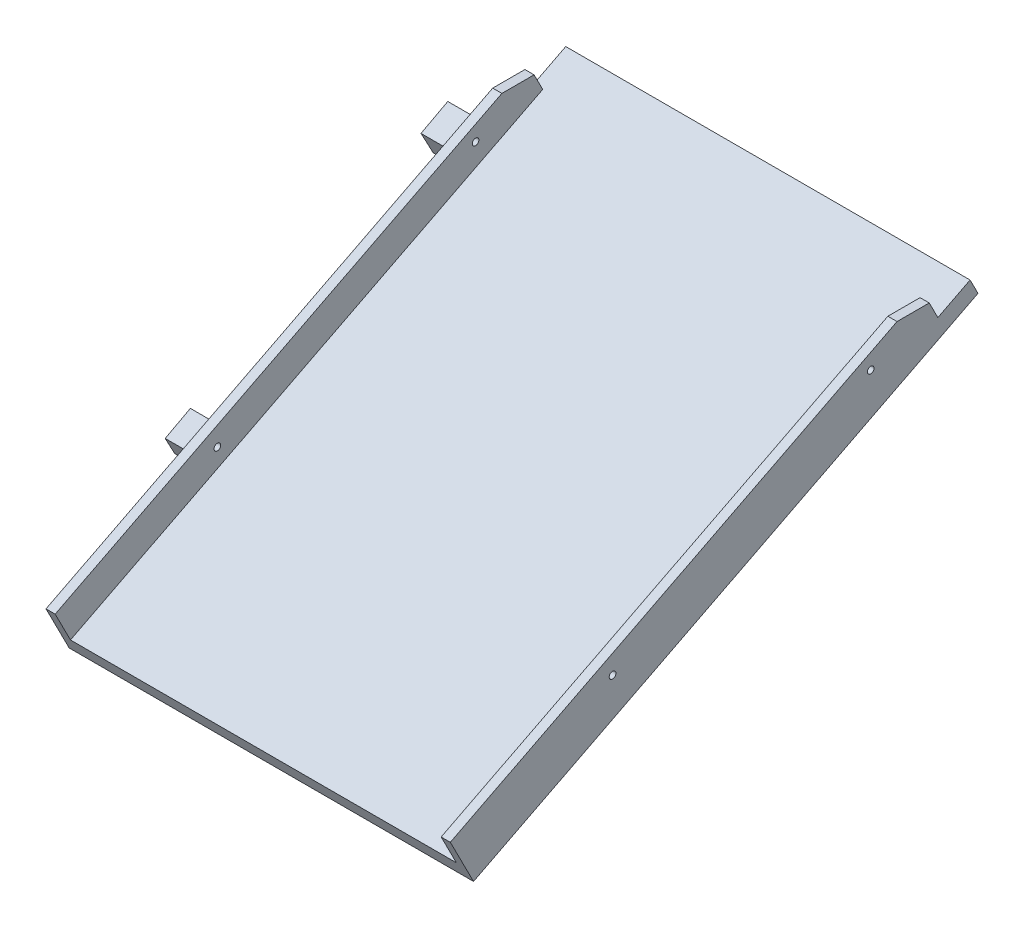
ISO-10303-21;
HEADER;
FILE_DESCRIPTION(('STEP AP214'),'2;1');
FILE_NAME('part.step','',(''),(''),'','','');
FILE_SCHEMA(('AUTOMOTIVE_DESIGN { 1 0 10303 214 1 1 1 1 }'));
ENDSEC;
DATA;
#1=APPLICATION_CONTEXT('core data for automotive mechanical design processes');
#2=APPLICATION_PROTOCOL_DEFINITION('international standard','automotive_design',2000,#1);
#3=PRODUCT_CONTEXT('',#1,'mechanical');
#4=PRODUCT('Part','Part','',(#3));
#5=PRODUCT_RELATED_PRODUCT_CATEGORY('part','',(#4));
#6=PRODUCT_DEFINITION_FORMATION('','',#4);
#7=PRODUCT_DEFINITION_CONTEXT('part definition',#1,'design');
#8=PRODUCT_DEFINITION('design','',#6,#7);
#9=PRODUCT_DEFINITION_SHAPE('','',#8);
#10=(LENGTH_UNIT() NAMED_UNIT(*) SI_UNIT(.MILLI.,.METRE.));
#11=(NAMED_UNIT(*) PLANE_ANGLE_UNIT() SI_UNIT($,.RADIAN.));
#12=(NAMED_UNIT(*) SI_UNIT($,.STERADIAN.) SOLID_ANGLE_UNIT());
#13=UNCERTAINTY_MEASURE_WITH_UNIT(LENGTH_MEASURE(1.E-05),#10,'distance_accuracy_value','');
#14=(GEOMETRIC_REPRESENTATION_CONTEXT(3) GLOBAL_UNCERTAINTY_ASSIGNED_CONTEXT((#13)) GLOBAL_UNIT_ASSIGNED_CONTEXT((#10,
#11,#12)) REPRESENTATION_CONTEXT('',''));
#15=CARTESIAN_POINT('',(0.,0.,0.));
#16=DIRECTION('',(0.,0.,1.));
#17=DIRECTION('',(1.,0.,0.));
#18=AXIS2_PLACEMENT_3D('',#15,#16,#17);
#19=CARTESIAN_POINT('',(0.,713.795181732599,-1033.05281526161));
#20=DIRECTION('',(0.,-0.453990499739548,0.891006524188367));
#21=DIRECTION('',(0.,-0.891006524188367,-0.453990499739548));
#22=AXIS2_PLACEMENT_3D('',#19,#20,#21);
#23=PLANE('',#22);
#24=DIRECTION('',(0.,-0.891006524188367,-0.453990499739548));
#25=VECTOR('',#24,1.);
#26=CARTESIAN_POINT('',(-30.,713.795181732599,-1033.05281526161));
#27=LINE('',#26,#25);
#28=CARTESIAN_POINT('',(-30.,671.238309324789,-1054.73662480428));
#29=VERTEX_POINT('',#28);
#30=CARTESIAN_POINT('',(-30.,615.784464071877,-1082.99177023296));
#31=VERTEX_POINT('',#30);
#32=EDGE_CURVE('E189',#29,#31,#27,.T.);
#33=ORIENTED_EDGE('',*,*,#32,.F.);
#34=DIRECTION('',(-1.,0.,0.));
#35=VECTOR('',#34,1.);
#36=CARTESIAN_POINT('',(10.,671.238309324789,-1054.73662480428));
#37=LINE('',#36,#35);
#38=CARTESIAN_POINT('',(0.,671.238309324789,-1054.73662480428));
#39=VERTEX_POINT('',#38);
#40=EDGE_CURVE('E218',#39,#29,#37,.T.);
#41=ORIENTED_EDGE('',*,*,#40,.F.);
#42=DIRECTION('',(0.,-0.891006524188367,-0.453990499739548));
#43=VECTOR('',#42,1.);
#44=CARTESIAN_POINT('',(0.,713.795181732599,-1033.05281526161));
#45=LINE('',#44,#43);
#46=CARTESIAN_POINT('',(0.,615.784464071878,-1082.99177023296));
#47=VERTEX_POINT('',#46);
#48=EDGE_CURVE('E314',#39,#47,#45,.T.);
#49=ORIENTED_EDGE('',*,*,#48,.T.);
#50=DIRECTION('',(-1.,0.,0.));
#51=VECTOR('',#50,1.);
#52=CARTESIAN_POINT('',(0.,615.784464071878,-1082.99177023296));
#53=LINE('',#52,#51);
#54=EDGE_CURVE('E309',#47,#31,#53,.T.);
#55=ORIENTED_EDGE('',*,*,#54,.T.);
#56=EDGE_LOOP('',(#33,#41,#49,#55));
#57=FACE_BOUND('',#56,.T.);
#58=ADVANCED_FACE('F35',(#57),#23,.F.);
#59=CARTESIAN_POINT('',(0.,148.798089539457,75.8164134565045));
#60=DIRECTION('',(0.,0.891006524188367,0.453990499739548));
#61=DIRECTION('',(0.,-0.453990499739548,0.891006524188367));
#62=AXIS2_PLACEMENT_3D('',#59,#60,#61);
#63=PLANE('',#62);
#64=DIRECTION('',(-1.,0.,0.));
#65=VECTOR('',#64,1.);
#66=CARTESIAN_POINT('',(10.,671.238309324789,-949.530250392603));
#67=LINE('',#66,#65);
#68=CARTESIAN_POINT('',(0.,671.238309324789,-949.530250392603));
#69=VERTEX_POINT('',#68);
#70=CARTESIAN_POINT('',(-30.,671.238309324789,-949.530250392603));
#71=VERTEX_POINT('',#70);
#72=EDGE_CURVE('E219',#69,#71,#67,.T.);
#73=ORIENTED_EDGE('',*,*,#72,.T.);
#74=DIRECTION('',(0.,-0.453990499739548,0.891006524188367));
#75=VECTOR('',#74,1.);
#76=CARTESIAN_POINT('',(-30.,148.798089539457,75.8164134565045));
#77=LINE('',#76,#75);
#78=CARTESIAN_POINT('',(-30.,-72.885471483364,510.894899217684));
#79=VERTEX_POINT('',#78);
#80=EDGE_CURVE('E57',#71,#79,#77,.T.);
#81=ORIENTED_EDGE('',*,*,#80,.T.);
#82=DIRECTION('',(1.,0.,0.));
#83=VECTOR('',#82,1.);
#84=CARTESIAN_POINT('',(-67.8425975613666,-72.8854714833639,510.894899217684));
#85=LINE('',#84,#83);
#86=CARTESIAN_POINT('',(0.,-72.8854714833639,510.894899217684));
#87=VERTEX_POINT('',#86);
#88=EDGE_CURVE('E194',#79,#87,#85,.T.);
#89=ORIENTED_EDGE('',*,*,#88,.T.);
#90=DIRECTION('',(0.,0.453990499739548,-0.891006524188367));
#91=VECTOR('',#90,1.);
#92=CARTESIAN_POINT('',(0.,148.798089539457,75.8164134565045));
#93=LINE('',#92,#91);
#94=EDGE_CURVE('E310',#87,#69,#93,.T.);
#95=ORIENTED_EDGE('',*,*,#94,.T.);
#96=EDGE_LOOP('',(#73,#81,#89,#95));
#97=FACE_BOUND('',#96,.T.);
#98=ADVANCED_FACE('F358',(#97),#63,.T.);
#99=CARTESIAN_POINT('',(-1321.80934580393,713.795181732599,-1033.05281526161));
#100=DIRECTION('',(0.,-0.453990499739548,0.891006524188367));
#101=DIRECTION('',(0.,-0.891006524188367,-0.453990499739548));
#102=AXIS2_PLACEMENT_3D('',#99,#100,#101);
#103=PLANE('',#102);
#104=DIRECTION('',(0.,0.891006524188367,0.453990499739548));
#105=VECTOR('',#104,1.);
#106=CARTESIAN_POINT('',(-1291.80934580393,713.795181732599,-1033.05281526161));
#107=LINE('',#106,#105);
#108=CARTESIAN_POINT('',(-1291.80934580393,615.784464071876,-1082.99177023296));
#109=VERTEX_POINT('',#108);
#110=CARTESIAN_POINT('',(-1291.80934580393,671.238309324789,-1054.73662480428));
#111=VERTEX_POINT('',#110);
#112=EDGE_CURVE('E50',#109,#111,#107,.T.);
#113=ORIENTED_EDGE('',*,*,#112,.F.);
#114=DIRECTION('',(-1.,0.,0.));
#115=VECTOR('',#114,1.);
#116=CARTESIAN_POINT('',(-1321.80934580393,615.784464071878,-1082.99177023296));
#117=LINE('',#116,#115);
#118=CARTESIAN_POINT('',(-1321.80934580393,615.784464071878,-1082.99177023296));
#119=VERTEX_POINT('',#118);
#120=EDGE_CURVE('E299',#109,#119,#117,.T.);
#121=ORIENTED_EDGE('',*,*,#120,.T.);
#122=DIRECTION('',(0.,-0.891006524188367,-0.453990499739548));
#123=VECTOR('',#122,1.);
#124=CARTESIAN_POINT('',(-1321.80934580393,713.795181732599,-1033.05281526161));
#125=LINE('',#124,#123);
#126=CARTESIAN_POINT('',(-1321.80934580393,671.238309324789,-1054.73662480428));
#127=VERTEX_POINT('',#126);
#128=EDGE_CURVE('E305',#127,#119,#125,.T.);
#129=ORIENTED_EDGE('',*,*,#128,.F.);
#130=EDGE_CURVE('E216',#111,#127,#37,.T.);
#131=ORIENTED_EDGE('',*,*,#130,.F.);
#132=EDGE_LOOP('',(#113,#121,#129,#131));
#133=FACE_BOUND('',#132,.T.);
#134=ADVANCED_FACE('F377',(#133),#103,.F.);
#135=CARTESIAN_POINT('',(0.,148.798089539457,75.8164134565045));
#136=DIRECTION('',(0.,-0.891006524188367,-0.453990499739548));
#137=DIRECTION('',(0.,0.453990499739548,-0.891006524188367));
#138=AXIS2_PLACEMENT_3D('',#135,#136,#137);
#139=PLANE('',#138);
#140=DIRECTION('',(0.,-0.453990499739548,0.891006524188367));
#141=VECTOR('',#140,1.);
#142=CARTESIAN_POINT('',(-1291.80934580393,148.798089539457,75.8164134565045));
#143=LINE('',#142,#141);
#144=CARTESIAN_POINT('',(-1291.80934580393,671.238309324789,-949.530250392603));
#145=VERTEX_POINT('',#144);
#146=CARTESIAN_POINT('',(-1291.80934580393,-72.8854714833639,510.894899217684));
#147=VERTEX_POINT('',#146);
#148=EDGE_CURVE('E205',#145,#147,#143,.T.);
#149=ORIENTED_EDGE('',*,*,#148,.F.);
#150=DIRECTION('',(1.,0.,0.));
#151=VECTOR('',#150,1.);
#152=CARTESIAN_POINT('',(0.,671.238309324789,-949.530250392603));
#153=LINE('',#152,#151);
#154=CARTESIAN_POINT('',(-1321.80934580393,671.238309324789,-949.530250392603));
#155=VERTEX_POINT('',#154);
#156=EDGE_CURVE('E342',#155,#145,#153,.T.);
#157=ORIENTED_EDGE('',*,*,#156,.F.);
#158=DIRECTION('',(0.,-0.453990499739548,0.891006524188367));
#159=VECTOR('',#158,1.);
#160=CARTESIAN_POINT('',(-1321.80934580393,148.798089539457,75.8164134565045));
#161=LINE('',#160,#159);
#162=CARTESIAN_POINT('',(-1321.80934580393,-72.8854714833639,510.894899217684));
#163=VERTEX_POINT('',#162);
#164=EDGE_CURVE('E300',#155,#163,#161,.T.);
#165=ORIENTED_EDGE('',*,*,#164,.T.);
#166=DIRECTION('',(1.,0.,0.));
#167=VECTOR('',#166,1.);
#168=CARTESIAN_POINT('',(-1253.96674824256,-72.8854714833639,510.894899217684));
#169=LINE('',#168,#167);
#170=EDGE_CURVE('E302',#163,#147,#169,.T.);
#171=ORIENTED_EDGE('',*,*,#170,.T.);
#172=EDGE_LOOP('',(#149,#157,#165,#171));
#173=FACE_BOUND('',#172,.T.);
#174=ADVANCED_FACE('F384',(#173),#139,.F.);
#175=CARTESIAN_POINT('',(-1321.80934580393,-221.683561022821,435.07848576118));
#176=DIRECTION('',(0.,-0.453990499739547,0.891006524188368));
#177=DIRECTION('',(0.,-0.891006524188368,-0.453990499739547));
#178=AXIS2_PLACEMENT_3D('',#175,#176,#177);
#179=PLANE('',#178);
#180=ORIENTED_EDGE('',*,*,#88,.F.);
#181=DIRECTION('',(0.,-0.891006524188368,-0.453990499739547));
#182=VECTOR('',#181,1.);
#183=CARTESIAN_POINT('',(-30.,-221.683561022821,435.07848576118));
#184=LINE('',#183,#182);
#185=CARTESIAN_POINT('',(-30.,-170.896189144084,460.955944246334));
#186=VERTEX_POINT('',#185);
#187=EDGE_CURVE('E187',#79,#186,#184,.T.);
#188=ORIENTED_EDGE('',*,*,#187,.T.);
#189=DIRECTION('',(1.,0.,0.));
#190=VECTOR('',#189,1.);
#191=CARTESIAN_POINT('',(-1321.80934580393,-170.896189144084,460.955944246334));
#192=LINE('',#191,#190);
#193=CARTESIAN_POINT('',(-1291.80934580393,-170.896189144084,460.955944246334));
#194=VERTEX_POINT('',#193);
#195=EDGE_CURVE('E171',#194,#186,#192,.T.);
#196=ORIENTED_EDGE('',*,*,#195,.F.);
#197=DIRECTION('',(0.,0.891006524188368,0.453990499739547));
#198=VECTOR('',#197,1.);
#199=CARTESIAN_POINT('',(-1291.80934580393,-221.683561022821,435.07848576118));
#200=LINE('',#199,#198);
#201=EDGE_CURVE('E208',#194,#147,#200,.T.);
#202=ORIENTED_EDGE('',*,*,#201,.T.);
#203=ORIENTED_EDGE('',*,*,#170,.F.);
#204=DIRECTION('',(0.,-0.891006524188368,-0.453990499739547));
#205=VECTOR('',#204,1.);
#206=CARTESIAN_POINT('',(-1321.80934580393,-221.683561022821,435.07848576118));
#207=LINE('',#206,#205);
#208=CARTESIAN_POINT('',(-1321.80934580393,-221.683561022821,435.07848576118));
#209=VERTEX_POINT('',#208);
#210=EDGE_CURVE('E327',#163,#209,#207,.T.);
#211=ORIENTED_EDGE('',*,*,#210,.T.);
#212=DIRECTION('',(1.,0.,0.));
#213=VECTOR('',#212,1.);
#214=CARTESIAN_POINT('',(-1321.80934580393,-221.683561022821,435.07848576118));
#215=LINE('',#214,#213);
#216=CARTESIAN_POINT('',(0.,-221.683561022821,435.07848576118));
#217=VERTEX_POINT('',#216);
#218=EDGE_CURVE('E183',#209,#217,#215,.T.);
#219=ORIENTED_EDGE('',*,*,#218,.T.);
#220=DIRECTION('',(0.,-0.891006524188368,-0.453990499739547));
#221=VECTOR('',#220,1.);
#222=CARTESIAN_POINT('',(0.,-221.683561022821,435.07848576118));
#223=LINE('',#222,#221);
#224=EDGE_CURVE('E321',#87,#217,#223,.T.);
#225=ORIENTED_EDGE('',*,*,#224,.F.);
#226=EDGE_LOOP('',(#180,#188,#196,#202,#203,#211,#219,#225));
#227=FACE_BOUND('',#226,.T.);
#228=ADVANCED_FACE('F192',(#227),#179,.T.);
#229=CARTESIAN_POINT('',(390.,576.93624525945,-863.46281687883));
#230=DIRECTION('',(-1.,0.,0.));
#231=DIRECTION('',(0.,0.,1.));
#232=AXIS2_PLACEMENT_3D('',#229,#230,#231);
#233=CYLINDRICAL_SURFACE('',#232,10.8050858649397);
#234=CARTESIAN_POINT('',(-1401.80934580393,576.93624525945,-863.46281687883));
#235=DIRECTION('',(-1.,0.,0.));
#236=DIRECTION('',(0.,0.,1.));
#237=AXIS2_PLACEMENT_3D('',#234,#235,#236);
#238=CIRCLE('',#237,10.8050858649397);
#239=CARTESIAN_POINT('',(-1401.80934580393,576.93624525945,-852.65773101389));
#240=VERTEX_POINT('',#239);
#241=EDGE_CURVE('E227',#240,#240,#238,.F.);
#242=ORIENTED_EDGE('',*,*,#241,.F.);
#243=EDGE_LOOP('',(#242));
#244=FACE_BOUND('',#243,.T.);
#245=CARTESIAN_POINT('',(-1291.80934580393,576.93624525945,-863.46281687883));
#246=DIRECTION('',(1.,0.,0.));
#247=DIRECTION('',(0.,0.,-1.));
#248=AXIS2_PLACEMENT_3D('',#245,#246,#247);
#249=CIRCLE('',#248,10.8050858649397);
#250=CARTESIAN_POINT('',(-1291.80934580393,576.93624525945,-874.267902743769));
#251=VERTEX_POINT('',#250);
#252=EDGE_CURVE('E213',#251,#251,#249,.T.);
#253=ORIENTED_EDGE('',*,*,#252,.T.);
#254=EDGE_LOOP('',(#253));
#255=FACE_BOUND('',#254,.T.);
#256=ADVANCED_FACE('F414',(#244,#255),#233,.F.);
#257=CARTESIAN_POINT('',(390.,135.017213440952,-19.4530162918449));
#258=DIRECTION('',(-1.,0.,0.));
#259=DIRECTION('',(0.,0.,1.));
#260=AXIS2_PLACEMENT_3D('',#257,#258,#259);
#261=CYLINDRICAL_SURFACE('',#260,10.9357547954486);
#262=CARTESIAN_POINT('',(-1401.80934580393,135.017213440952,-19.4530162918449));
#263=DIRECTION('',(-1.,0.,0.));
#264=DIRECTION('',(0.,0.,1.));
#265=AXIS2_PLACEMENT_3D('',#262,#263,#264);
#266=CIRCLE('',#265,10.9357547954486);
#267=CARTESIAN_POINT('',(-1401.80934580393,135.017213440952,-8.5172614963963));
#268=VERTEX_POINT('',#267);
#269=EDGE_CURVE('E231',#268,#268,#266,.F.);
#270=ORIENTED_EDGE('',*,*,#269,.F.);
#271=EDGE_LOOP('',(#270));
#272=FACE_BOUND('',#271,.T.);
#273=CARTESIAN_POINT('',(-1291.80934580393,135.017213440952,-19.4530162918449));
#274=DIRECTION('',(1.,0.,0.));
#275=DIRECTION('',(0.,0.,-1.));
#276=AXIS2_PLACEMENT_3D('',#273,#274,#275);
#277=CIRCLE('',#276,10.9357547954486);
#278=CARTESIAN_POINT('',(-1291.80934580393,135.017213440952,-30.3887710872936));
#279=VERTEX_POINT('',#278);
#280=EDGE_CURVE('E210',#279,#279,#277,.T.);
#281=ORIENTED_EDGE('',*,*,#280,.T.);
#282=EDGE_LOOP('',(#281));
#283=FACE_BOUND('',#282,.T.);
#284=ADVANCED_FACE('F484',(#272,#283),#261,.F.);
#285=CARTESIAN_POINT('',(0.,576.93624525945,-863.46281687883));
#286=DIRECTION('',(-1.,0.,0.));
#287=DIRECTION('',(0.,0.,1.));
#288=AXIS2_PLACEMENT_3D('',#285,#286,#287);
#289=CIRCLE('',#288,10.8050858649397);
#290=CARTESIAN_POINT('',(0.,576.93624525945,-852.65773101389));
#291=VERTEX_POINT('',#290);
#292=EDGE_CURVE('E228',#291,#291,#289,.F.);
#293=ORIENTED_EDGE('',*,*,#292,.T.);
#294=EDGE_LOOP('',(#293));
#295=FACE_BOUND('',#294,.T.);
#296=CARTESIAN_POINT('',(-30.,576.93624525945,-863.46281687883));
#297=DIRECTION('',(-1.,0.,0.));
#298=DIRECTION('',(0.,0.,1.));
#299=AXIS2_PLACEMENT_3D('',#296,#297,#298);
#300=CIRCLE('',#299,10.8050858649397);
#301=CARTESIAN_POINT('',(-30.,576.93624525945,-852.65773101389));
#302=VERTEX_POINT('',#301);
#303=EDGE_CURVE('E198',#302,#302,#300,.T.);
#304=ORIENTED_EDGE('',*,*,#303,.T.);
#305=EDGE_LOOP('',(#304));
#306=FACE_BOUND('',#305,.T.);
#307=ADVANCED_FACE('F487',(#295,#306),#233,.F.);
#308=CARTESIAN_POINT('',(0.,135.017213440952,-19.4530162918449));
#309=DIRECTION('',(-1.,0.,0.));
#310=DIRECTION('',(0.,0.,1.));
#311=AXIS2_PLACEMENT_3D('',#308,#309,#310);
#312=CIRCLE('',#311,10.9357547954486);
#313=CARTESIAN_POINT('',(0.,135.017213440952,-8.5172614963963));
#314=VERTEX_POINT('',#313);
#315=EDGE_CURVE('E232',#314,#314,#312,.F.);
#316=ORIENTED_EDGE('',*,*,#315,.T.);
#317=EDGE_LOOP('',(#316));
#318=FACE_BOUND('',#317,.T.);
#319=CARTESIAN_POINT('',(-30.,135.017213440952,-19.4530162918449));
#320=DIRECTION('',(-1.,0.,0.));
#321=DIRECTION('',(0.,0.,1.));
#322=AXIS2_PLACEMENT_3D('',#319,#320,#321);
#323=CIRCLE('',#322,10.9357547954486);
#324=CARTESIAN_POINT('',(-30.,135.017213440952,-8.5172614963963));
#325=VERTEX_POINT('',#324);
#326=EDGE_CURVE('E195',#325,#325,#323,.T.);
#327=ORIENTED_EDGE('',*,*,#326,.T.);
#328=EDGE_LOOP('',(#327));
#329=FACE_BOUND('',#328,.T.);
#330=ADVANCED_FACE('F496',(#318,#329),#261,.F.);
#331=CARTESIAN_POINT('',(10.,671.238309324789,-1054.73662480428));
#332=DIRECTION('',(0.,1.,0.));
#333=DIRECTION('',(0.,0.,1.));
#334=AXIS2_PLACEMENT_3D('',#331,#332,#333);
#335=PLANE('',#334);
#336=ORIENTED_EDGE('',*,*,#156,.T.);
#337=DIRECTION('',(0.,0.,-1.));
#338=VECTOR('',#337,1.);
#339=CARTESIAN_POINT('',(-1291.80934580393,671.238309324789,-1054.73662480428));
#340=LINE('',#339,#338);
#341=EDGE_CURVE('E11',#145,#111,#340,.T.);
#342=ORIENTED_EDGE('',*,*,#341,.T.);
#343=ORIENTED_EDGE('',*,*,#130,.T.);
#344=DIRECTION('',(0.,0.,-1.));
#345=VECTOR('',#344,1.);
#346=CARTESIAN_POINT('',(-1321.80934580393,671.238309324786,2.12503537981478E-12));
#347=LINE('',#346,#345);
#348=EDGE_CURVE('E224',#155,#127,#347,.T.);
#349=ORIENTED_EDGE('',*,*,#348,.F.);
#350=EDGE_LOOP('',(#336,#342,#343,#349));
#351=FACE_BOUND('',#350,.T.);
#352=ADVANCED_FACE('F379',(#351),#335,.T.);
#353=ORIENTED_EDGE('',*,*,#40,.T.);
#354=DIRECTION('',(0.,0.,1.));
#355=VECTOR('',#354,1.);
#356=CARTESIAN_POINT('',(-30.,671.238309324789,-1054.73662480428));
#357=LINE('',#356,#355);
#358=EDGE_CURVE('E43',#29,#71,#357,.T.);
#359=ORIENTED_EDGE('',*,*,#358,.T.);
#360=ORIENTED_EDGE('',*,*,#72,.F.);
#361=DIRECTION('',(0.,0.,-1.));
#362=VECTOR('',#361,1.);
#363=CARTESIAN_POINT('',(0.,671.238309324786,2.12503537981478E-12));
#364=LINE('',#363,#362);
#365=EDGE_CURVE('E222',#69,#39,#364,.T.);
#366=ORIENTED_EDGE('',*,*,#365,.T.);
#367=EDGE_LOOP('',(#353,#359,#360,#366));
#368=FACE_BOUND('',#367,.T.);
#369=ADVANCED_FACE('F354',(#368),#335,.T.);
#370=CARTESIAN_POINT('',(-1321.80934580393,0.,0.));
#371=DIRECTION('',(-1.,0.,0.));
#372=DIRECTION('',(0.,0.,1.));
#373=AXIS2_PLACEMENT_3D('',#370,#371,#372);
#374=PLANE('',#373);
#375=DIRECTION('',(0.,0.882586031343818,0.470150930315755));
#376=VECTOR('',#375,1.);
#377=CARTESIAN_POINT('',(-1321.80934580393,504.780648084918,-947.594315283435));
#378=LINE('',#377,#376);
#379=CARTESIAN_POINT('',(-1321.80934580393,551.922167035328,-922.482169607067));
#380=VERTEX_POINT('',#379);
#381=CARTESIAN_POINT('',(-1321.80934580393,626.858827585302,-882.563635411955));
#382=VERTEX_POINT('',#381);
#383=EDGE_CURVE('E235',#380,#382,#378,.T.);
#384=ORIENTED_EDGE('',*,*,#383,.T.);
#385=DIRECTION('',(0.,-0.470150930315754,0.882586031343818));
#386=VECTOR('',#385,1.);
#387=CARTESIAN_POINT('',(-1321.80934580393,122.078179500385,65.0306798714796));
#388=LINE('',#387,#386);
#389=CARTESIAN_POINT('',(-1321.80934580393,580.236826076621,-795.042959323498));
#390=VERTEX_POINT('',#389);
#391=EDGE_CURVE('E240',#382,#390,#388,.T.);
#392=ORIENTED_EDGE('',*,*,#391,.T.);
#393=DIRECTION('',(0.,-0.882586031343818,-0.470150930315755));
#394=VECTOR('',#393,1.);
#395=CARTESIAN_POINT('',(-1321.80934580393,458.158646576237,-860.073639194978));
#396=LINE('',#395,#394);
#397=CARTESIAN_POINT('',(-1321.80934580393,505.300165526648,-834.96149351861));
#398=VERTEX_POINT('',#397);
#399=EDGE_CURVE('E253',#390,#398,#396,.T.);
#400=ORIENTED_EDGE('',*,*,#399,.T.);
#401=DIRECTION('',(0.,0.470150930315754,-0.882586031343818));
#402=VECTOR('',#401,1.);
#403=CARTESIAN_POINT('',(-1321.80934580393,47.1415189504113,25.1121456763682));
#404=LINE('',#403,#402);
#405=EDGE_CURVE('E251',#398,#380,#404,.T.);
#406=ORIENTED_EDGE('',*,*,#405,.T.);
#407=EDGE_LOOP('',(#384,#392,#400,#406));
#408=FACE_BOUND('',#407,.T.);
#409=DIRECTION('',(0.,-0.470150930315755,0.882586031343818));
#410=VECTOR('',#409,1.);
#411=CARTESIAN_POINT('',(-1321.80934580393,122.078179500384,65.0306798714794));
#412=LINE('',#411,#410);
#413=CARTESIAN_POINT('',(-1321.80934580393,178.631674443184,-41.1337908159791));
#414=VERTEX_POINT('',#413);
#415=CARTESIAN_POINT('',(-1321.80934580393,134.758128501832,41.227375134182));
#416=VERTEX_POINT('',#415);
#417=EDGE_CURVE('E267',#414,#416,#412,.T.);
#418=ORIENTED_EDGE('',*,*,#417,.T.);
#419=DIRECTION('',(0.,-0.882586031343818,-0.470150930315755));
#420=VECTOR('',#419,1.);
#421=CARTESIAN_POINT('',(-1321.80934580393,12.6799490014478,-23.8033047372974));
#422=LINE('',#421,#420);
#423=CARTESIAN_POINT('',(-1321.80934580393,76.1045942134309,9.98281343404757));
#424=VERTEX_POINT('',#423);
#425=EDGE_CURVE('E272',#416,#424,#422,.T.);
#426=ORIENTED_EDGE('',*,*,#425,.T.);
#427=DIRECTION('',(0.,0.470150930315755,-0.882586031343818));
#428=VECTOR('',#427,1.);
#429=CARTESIAN_POINT('',(-1321.80934580393,63.4246452119832,33.786118171345));
#430=LINE('',#429,#428);
#431=CARTESIAN_POINT('',(-1321.80934580393,119.978140154783,-72.3783525161136));
#432=VERTEX_POINT('',#431);
#433=EDGE_CURVE('E285',#424,#432,#430,.T.);
#434=ORIENTED_EDGE('',*,*,#433,.T.);
#435=DIRECTION('',(0.,-0.882586031343818,-0.470150930315755));
#436=VECTOR('',#435,1.);
#437=CARTESIAN_POINT('',(-1321.80934580393,56.5534949427998,-106.164470687458));
#438=LINE('',#437,#436);
#439=EDGE_CURVE('E282',#414,#432,#438,.T.);
#440=ORIENTED_EDGE('',*,*,#439,.F.);
#441=EDGE_LOOP('',(#418,#426,#434,#440));
#442=FACE_BOUND('',#441,.T.);
#443=ORIENTED_EDGE('',*,*,#164,.F.);
#444=ORIENTED_EDGE('',*,*,#348,.T.);
#445=ORIENTED_EDGE('',*,*,#128,.T.);
#446=DIRECTION('',(0.,-0.453990499739548,0.891006524188367));
#447=VECTOR('',#446,1.);
#448=CARTESIAN_POINT('',(-1321.80934580393,50.7873718787369,25.8774584851542));
#449=LINE('',#448,#447);
#450=CARTESIAN_POINT('',(-1321.80934580393,669.440225873819,-1188.29713202633));
#451=VERTEX_POINT('',#450);
#452=EDGE_CURVE('E324',#451,#119,#449,.T.);
#453=ORIENTED_EDGE('',*,*,#452,.F.);
#454=DIRECTION('',(0.,0.891006524188365,0.453990499739553));
#455=VECTOR('',#454,1.);
#456=CARTESIAN_POINT('',(-1321.80934580393,669.440225873819,-1188.29713202633));
#457=LINE('',#456,#455);
#458=CARTESIAN_POINT('',(-1321.80934580393,618.652853995082,-1214.17459051149));
#459=VERTEX_POINT('',#458);
#460=EDGE_CURVE('E320',#459,#451,#457,.T.);
#461=ORIENTED_EDGE('',*,*,#460,.F.);
#462=DIRECTION('',(0.,0.453990499739548,-0.891006524188367));
#463=VECTOR('',#462,1.);
#464=CARTESIAN_POINT('',(-1321.80934580393,0.,0.));
#465=LINE('',#464,#463);
#466=EDGE_CURVE('E318',#209,#459,#465,.T.);
#467=ORIENTED_EDGE('',*,*,#466,.F.);
#468=ORIENTED_EDGE('',*,*,#210,.F.);
#469=EDGE_LOOP('',(#443,#444,#445,#453,#461,#467,#468));
#470=FACE_BOUND('',#469,.T.);
#471=ADVANCED_FACE('F372',(#408,#442,#470),#374,.T.);
#472=CARTESIAN_POINT('',(0.,0.,0.));
#473=DIRECTION('',(-1.,0.,0.));
#474=DIRECTION('',(0.,0.,1.));
#475=AXIS2_PLACEMENT_3D('',#472,#473,#474);
#476=PLANE('',#475);
#477=ORIENTED_EDGE('',*,*,#292,.F.);
#478=EDGE_LOOP('',(#477));
#479=FACE_BOUND('',#478,.T.);
#480=ORIENTED_EDGE('',*,*,#315,.F.);
#481=EDGE_LOOP('',(#480));
#482=FACE_BOUND('',#481,.T.);
#483=ORIENTED_EDGE('',*,*,#365,.F.);
#484=ORIENTED_EDGE('',*,*,#94,.F.);
#485=ORIENTED_EDGE('',*,*,#224,.T.);
#486=DIRECTION('',(0.,0.453990499739548,-0.891006524188367));
#487=VECTOR('',#486,1.);
#488=CARTESIAN_POINT('',(0.,0.,0.));
#489=LINE('',#488,#487);
#490=CARTESIAN_POINT('',(0.,618.652853995082,-1214.17459051149));
#491=VERTEX_POINT('',#490);
#492=EDGE_CURVE('E317',#217,#491,#489,.T.);
#493=ORIENTED_EDGE('',*,*,#492,.T.);
#494=DIRECTION('',(0.,0.891006524188365,0.453990499739553));
#495=VECTOR('',#494,1.);
#496=CARTESIAN_POINT('',(0.,669.440225873819,-1188.29713202633));
#497=LINE('',#496,#495);
#498=CARTESIAN_POINT('',(0.,669.440225873819,-1188.29713202633));
#499=VERTEX_POINT('',#498);
#500=EDGE_CURVE('E333',#491,#499,#497,.T.);
#501=ORIENTED_EDGE('',*,*,#500,.T.);
#502=DIRECTION('',(0.,-0.453990499739548,0.891006524188367));
#503=VECTOR('',#502,1.);
#504=CARTESIAN_POINT('',(0.,50.7873718787369,25.8774584851542));
#505=LINE('',#504,#503);
#506=EDGE_CURVE('E336',#499,#47,#505,.T.);
#507=ORIENTED_EDGE('',*,*,#506,.T.);
#508=ORIENTED_EDGE('',*,*,#48,.F.);
#509=EDGE_LOOP('',(#483,#484,#485,#493,#501,#507,#508));
#510=FACE_BOUND('',#509,.T.);
#511=ADVANCED_FACE('F361',(#479,#482,#510),#476,.F.);
#512=CARTESIAN_POINT('',(-1321.80934580393,50.7873718787369,25.8774584851542));
#513=DIRECTION('',(0.,0.891006524188367,0.453990499739548));
#514=DIRECTION('',(0.,-0.453990499739548,0.891006524188367));
#515=AXIS2_PLACEMENT_3D('',#512,#513,#514);
#516=PLANE('',#515);
#517=DIRECTION('',(0.,0.453990499739547,-0.891006524188368));
#518=VECTOR('',#517,1.);
#519=CARTESIAN_POINT('',(-30.,-897.280988727359,1886.56638294772));
#520=LINE('',#519,#518);
#521=EDGE_CURVE('E175',#186,#31,#520,.T.);
#522=ORIENTED_EDGE('',*,*,#521,.T.);
#523=ORIENTED_EDGE('',*,*,#54,.F.);
#524=ORIENTED_EDGE('',*,*,#506,.F.);
#525=DIRECTION('',(1.,0.,0.));
#526=VECTOR('',#525,1.);
#527=CARTESIAN_POINT('',(-1321.80934580393,669.440225873819,-1188.29713202633));
#528=LINE('',#527,#526);
#529=EDGE_CURVE('E184',#451,#499,#528,.T.);
#530=ORIENTED_EDGE('',*,*,#529,.F.);
#531=ORIENTED_EDGE('',*,*,#452,.T.);
#532=ORIENTED_EDGE('',*,*,#120,.F.);
#533=DIRECTION('',(0.,0.453990499739547,-0.891006524188368));
#534=VECTOR('',#533,1.);
#535=CARTESIAN_POINT('',(-1291.80934580393,-897.28098872736,1886.56638294772));
#536=LINE('',#535,#534);
#537=EDGE_CURVE('E178',#194,#109,#536,.T.);
#538=ORIENTED_EDGE('',*,*,#537,.F.);
#539=ORIENTED_EDGE('',*,*,#195,.T.);
#540=EDGE_LOOP('',(#522,#523,#524,#530,#531,#532,#538,#539));
#541=FACE_BOUND('',#540,.T.);
#542=ADVANCED_FACE('F173',(#541),#516,.T.);
#543=CARTESIAN_POINT('',(-1321.80934580393,669.440225873819,-1188.29713202633));
#544=DIRECTION('',(0.,0.453990499739553,-0.891006524188365));
#545=DIRECTION('',(0.,0.891006524188365,0.453990499739553));
#546=AXIS2_PLACEMENT_3D('',#543,#544,#545);
#547=PLANE('',#546);
#548=ORIENTED_EDGE('',*,*,#500,.F.);
#549=DIRECTION('',(1.,0.,0.));
#550=VECTOR('',#549,1.);
#551=CARTESIAN_POINT('',(-1321.80934580393,618.652853995082,-1214.17459051149));
#552=LINE('',#551,#550);
#553=EDGE_CURVE('E330',#459,#491,#552,.T.);
#554=ORIENTED_EDGE('',*,*,#553,.F.);
#555=ORIENTED_EDGE('',*,*,#460,.T.);
#556=ORIENTED_EDGE('',*,*,#529,.T.);
#557=EDGE_LOOP('',(#548,#554,#555,#556));
#558=FACE_BOUND('',#557,.T.);
#559=ADVANCED_FACE('F367',(#558),#547,.T.);
#560=CARTESIAN_POINT('',(-1321.80934580393,0.,0.));
#561=DIRECTION('',(0.,-0.891006524188367,-0.453990499739548));
#562=DIRECTION('',(0.,0.453990499739548,-0.891006524188367));
#563=AXIS2_PLACEMENT_3D('',#560,#561,#562);
#564=PLANE('',#563);
#565=ORIENTED_EDGE('',*,*,#492,.F.);
#566=ORIENTED_EDGE('',*,*,#218,.F.);
#567=ORIENTED_EDGE('',*,*,#466,.T.);
#568=ORIENTED_EDGE('',*,*,#553,.T.);
#569=EDGE_LOOP('',(#565,#566,#567,#568));
#570=FACE_BOUND('',#569,.T.);
#571=ADVANCED_FACE('F37',(#570),#564,.T.);
#572=CARTESIAN_POINT('',(-1401.80934580393,122.078179500384,65.0306798714794));
#573=DIRECTION('',(0.,0.882586031343818,0.470150930315755));
#574=DIRECTION('',(0.,-0.470150930315755,0.882586031343818));
#575=AXIS2_PLACEMENT_3D('',#572,#573,#574);
#576=PLANE('',#575);
#577=ORIENTED_EDGE('',*,*,#417,.F.);
#578=DIRECTION('',(1.,0.,0.));
#579=VECTOR('',#578,1.);
#580=CARTESIAN_POINT('',(-1401.80934580393,178.631674443184,-41.1337908159791));
#581=LINE('',#580,#579);
#582=CARTESIAN_POINT('',(-1401.80934580393,178.631674443184,-41.1337908159791));
#583=VERTEX_POINT('',#582);
#584=EDGE_CURVE('E296',#583,#414,#581,.T.);
#585=ORIENTED_EDGE('',*,*,#584,.F.);
#586=DIRECTION('',(0.,-0.470150930315755,0.882586031343818));
#587=VECTOR('',#586,1.);
#588=CARTESIAN_POINT('',(-1401.80934580393,122.078179500384,65.0306798714794));
#589=LINE('',#588,#587);
#590=CARTESIAN_POINT('',(-1401.80934580393,134.758128501832,41.227375134182));
#591=VERTEX_POINT('',#590);
#592=EDGE_CURVE('E268',#583,#591,#589,.T.);
#593=ORIENTED_EDGE('',*,*,#592,.T.);
#594=DIRECTION('',(1.,0.,0.));
#595=VECTOR('',#594,1.);
#596=CARTESIAN_POINT('',(-1401.80934580393,134.758128501832,41.227375134182));
#597=LINE('',#596,#595);
#598=EDGE_CURVE('E280',#591,#416,#597,.T.);
#599=ORIENTED_EDGE('',*,*,#598,.T.);
#600=EDGE_LOOP('',(#577,#585,#593,#599));
#601=FACE_BOUND('',#600,.T.);
#602=ADVANCED_FACE('F390',(#601),#576,.T.);
#603=CARTESIAN_POINT('',(-1401.80934580393,56.5534949427998,-106.164470687458));
#604=DIRECTION('',(0.,-0.470150930315755,0.882586031343818));
#605=DIRECTION('',(0.,-0.882586031343818,-0.470150930315755));
#606=AXIS2_PLACEMENT_3D('',#603,#604,#605);
#607=PLANE('',#606);
#608=ORIENTED_EDGE('',*,*,#439,.T.);
#609=DIRECTION('',(1.,0.,0.));
#610=VECTOR('',#609,1.);
#611=CARTESIAN_POINT('',(-1401.80934580393,119.978140154783,-72.3783525161136));
#612=LINE('',#611,#610);
#613=CARTESIAN_POINT('',(-1401.80934580393,119.978140154783,-72.3783525161136));
#614=VERTEX_POINT('',#613);
#615=EDGE_CURVE('E293',#614,#432,#612,.T.);
#616=ORIENTED_EDGE('',*,*,#615,.F.);
#617=DIRECTION('',(0.,-0.882586031343818,-0.470150930315755));
#618=VECTOR('',#617,1.);
#619=CARTESIAN_POINT('',(-1401.80934580393,56.5534949427998,-106.164470687458));
#620=LINE('',#619,#618);
#621=EDGE_CURVE('E271',#583,#614,#620,.T.);
#622=ORIENTED_EDGE('',*,*,#621,.F.);
#623=ORIENTED_EDGE('',*,*,#584,.T.);
#624=EDGE_LOOP('',(#608,#616,#622,#623));
#625=FACE_BOUND('',#624,.T.);
#626=ADVANCED_FACE('F395',(#625),#607,.F.);
#627=CARTESIAN_POINT('',(-1401.80934580393,63.4246452119832,33.786118171345));
#628=DIRECTION('',(0.,-0.882586031343818,-0.470150930315755));
#629=DIRECTION('',(0.,0.470150930315755,-0.882586031343818));
#630=AXIS2_PLACEMENT_3D('',#627,#628,#629);
#631=PLANE('',#630);
#632=ORIENTED_EDGE('',*,*,#433,.F.);
#633=DIRECTION('',(1.,0.,0.));
#634=VECTOR('',#633,1.);
#635=CARTESIAN_POINT('',(-1401.80934580393,76.1045942134309,9.98281343404756));
#636=LINE('',#635,#634);
#637=CARTESIAN_POINT('',(-1401.80934580393,76.1045942134309,9.98281343404756));
#638=VERTEX_POINT('',#637);
#639=EDGE_CURVE('E290',#638,#424,#636,.T.);
#640=ORIENTED_EDGE('',*,*,#639,.F.);
#641=DIRECTION('',(0.,0.470150930315755,-0.882586031343818));
#642=VECTOR('',#641,1.);
#643=CARTESIAN_POINT('',(-1401.80934580393,63.4246452119832,33.786118171345));
#644=LINE('',#643,#642);
#645=EDGE_CURVE('E274',#638,#614,#644,.T.);
#646=ORIENTED_EDGE('',*,*,#645,.T.);
#647=ORIENTED_EDGE('',*,*,#615,.T.);
#648=EDGE_LOOP('',(#632,#640,#646,#647));
#649=FACE_BOUND('',#648,.T.);
#650=ADVANCED_FACE('F590',(#649),#631,.T.);
#651=CARTESIAN_POINT('',(-1401.80934580393,12.6799490014478,-23.8033047372974));
#652=DIRECTION('',(0.,-0.470150930315755,0.882586031343818));
#653=DIRECTION('',(0.,-0.882586031343818,-0.470150930315755));
#654=AXIS2_PLACEMENT_3D('',#651,#652,#653);
#655=PLANE('',#654);
#656=ORIENTED_EDGE('',*,*,#425,.F.);
#657=ORIENTED_EDGE('',*,*,#598,.F.);
#658=DIRECTION('',(0.,-0.882586031343818,-0.470150930315755));
#659=VECTOR('',#658,1.);
#660=CARTESIAN_POINT('',(-1401.80934580393,12.6799490014478,-23.8033047372974));
#661=LINE('',#660,#659);
#662=EDGE_CURVE('E277',#591,#638,#661,.T.);
#663=ORIENTED_EDGE('',*,*,#662,.T.);
#664=ORIENTED_EDGE('',*,*,#639,.T.);
#665=EDGE_LOOP('',(#656,#657,#663,#664));
#666=FACE_BOUND('',#665,.T.);
#667=ADVANCED_FACE('F583',(#666),#655,.T.);
#668=CARTESIAN_POINT('',(-1401.80934580393,0.,0.));
#669=DIRECTION('',(-1.,0.,0.));
#670=DIRECTION('',(0.,0.,1.));
#671=AXIS2_PLACEMENT_3D('',#668,#669,#670);
#672=PLANE('',#671);
#673=ORIENTED_EDGE('',*,*,#269,.T.);
#674=EDGE_LOOP('',(#673));
#675=FACE_BOUND('',#674,.T.);
#676=ORIENTED_EDGE('',*,*,#592,.F.);
#677=ORIENTED_EDGE('',*,*,#621,.T.);
#678=ORIENTED_EDGE('',*,*,#645,.F.);
#679=ORIENTED_EDGE('',*,*,#662,.F.);
#680=EDGE_LOOP('',(#676,#677,#678,#679));
#681=FACE_BOUND('',#680,.T.);
#682=ADVANCED_FACE('F575',(#675,#681),#672,.T.);
#683=CARTESIAN_POINT('',(-1401.80934580393,504.780648084918,-947.594315283435));
#684=DIRECTION('',(0.,0.470150930315755,-0.882586031343818));
#685=DIRECTION('',(0.,0.882586031343818,0.470150930315755));
#686=AXIS2_PLACEMENT_3D('',#683,#684,#685);
#687=PLANE('',#686);
#688=ORIENTED_EDGE('',*,*,#383,.F.);
#689=DIRECTION('',(1.,0.,0.));
#690=VECTOR('',#689,1.);
#691=CARTESIAN_POINT('',(-1401.80934580393,551.922167035328,-922.482169607067));
#692=LINE('',#691,#690);
#693=CARTESIAN_POINT('',(-1401.80934580393,551.922167035328,-922.482169607067));
#694=VERTEX_POINT('',#693);
#695=EDGE_CURVE('E264',#694,#380,#692,.T.);
#696=ORIENTED_EDGE('',*,*,#695,.F.);
#697=DIRECTION('',(0.,0.882586031343818,0.470150930315755));
#698=VECTOR('',#697,1.);
#699=CARTESIAN_POINT('',(-1401.80934580393,504.780648084918,-947.594315283435));
#700=LINE('',#699,#698);
#701=CARTESIAN_POINT('',(-1401.80934580393,626.858827585302,-882.563635411955));
#702=VERTEX_POINT('',#701);
#703=EDGE_CURVE('E236',#694,#702,#700,.T.);
#704=ORIENTED_EDGE('',*,*,#703,.T.);
#705=DIRECTION('',(1.,0.,0.));
#706=VECTOR('',#705,1.);
#707=CARTESIAN_POINT('',(-1401.80934580393,626.858827585302,-882.563635411955));
#708=LINE('',#707,#706);
#709=EDGE_CURVE('E249',#702,#382,#708,.T.);
#710=ORIENTED_EDGE('',*,*,#709,.T.);
#711=EDGE_LOOP('',(#688,#696,#704,#710));
#712=FACE_BOUND('',#711,.T.);
#713=ADVANCED_FACE('F567',(#712),#687,.T.);
#714=CARTESIAN_POINT('',(-1401.80934580393,47.1415189504113,25.1121456763682));
#715=DIRECTION('',(0.,-0.882586031343818,-0.470150930315754));
#716=DIRECTION('',(0.,0.470150930315754,-0.882586031343818));
#717=AXIS2_PLACEMENT_3D('',#714,#715,#716);
#718=PLANE('',#717);
#719=ORIENTED_EDGE('',*,*,#405,.F.);
#720=DIRECTION('',(1.,0.,0.));
#721=VECTOR('',#720,1.);
#722=CARTESIAN_POINT('',(-1401.80934580393,505.300165526648,-834.96149351861));
#723=LINE('',#722,#721);
#724=CARTESIAN_POINT('',(-1401.80934580393,505.300165526648,-834.96149351861));
#725=VERTEX_POINT('',#724);
#726=EDGE_CURVE('E261',#725,#398,#723,.T.);
#727=ORIENTED_EDGE('',*,*,#726,.F.);
#728=DIRECTION('',(0.,0.470150930315754,-0.882586031343818));
#729=VECTOR('',#728,1.);
#730=CARTESIAN_POINT('',(-1401.80934580393,47.1415189504113,25.1121456763682));
#731=LINE('',#730,#729);
#732=EDGE_CURVE('E239',#725,#694,#731,.T.);
#733=ORIENTED_EDGE('',*,*,#732,.T.);
#734=ORIENTED_EDGE('',*,*,#695,.T.);
#735=EDGE_LOOP('',(#719,#727,#733,#734));
#736=FACE_BOUND('',#735,.T.);
#737=ADVANCED_FACE('F559',(#736),#718,.T.);
#738=CARTESIAN_POINT('',(-1401.80934580393,458.158646576237,-860.073639194978));
#739=DIRECTION('',(0.,-0.470150930315755,0.882586031343818));
#740=DIRECTION('',(0.,-0.882586031343818,-0.470150930315755));
#741=AXIS2_PLACEMENT_3D('',#738,#739,#740);
#742=PLANE('',#741);
#743=ORIENTED_EDGE('',*,*,#399,.F.);
#744=DIRECTION('',(1.,0.,0.));
#745=VECTOR('',#744,1.);
#746=CARTESIAN_POINT('',(-1401.80934580393,580.236826076621,-795.042959323498));
#747=LINE('',#746,#745);
#748=CARTESIAN_POINT('',(-1401.80934580393,580.236826076621,-795.042959323498));
#749=VERTEX_POINT('',#748);
#750=EDGE_CURVE('E258',#749,#390,#747,.T.);
#751=ORIENTED_EDGE('',*,*,#750,.F.);
#752=DIRECTION('',(0.,-0.882586031343818,-0.470150930315755));
#753=VECTOR('',#752,1.);
#754=CARTESIAN_POINT('',(-1401.80934580393,458.158646576237,-860.073639194978));
#755=LINE('',#754,#753);
#756=EDGE_CURVE('E243',#749,#725,#755,.T.);
#757=ORIENTED_EDGE('',*,*,#756,.T.);
#758=ORIENTED_EDGE('',*,*,#726,.T.);
#759=EDGE_LOOP('',(#743,#751,#757,#758));
#760=FACE_BOUND('',#759,.T.);
#761=ADVANCED_FACE('F551',(#760),#742,.T.);
#762=CARTESIAN_POINT('',(-1401.80934580393,122.078179500385,65.0306798714796));
#763=DIRECTION('',(0.,0.882586031343818,0.470150930315754));
#764=DIRECTION('',(0.,-0.470150930315754,0.882586031343818));
#765=AXIS2_PLACEMENT_3D('',#762,#763,#764);
#766=PLANE('',#765);
#767=ORIENTED_EDGE('',*,*,#391,.F.);
#768=ORIENTED_EDGE('',*,*,#709,.F.);
#769=DIRECTION('',(0.,-0.470150930315754,0.882586031343818));
#770=VECTOR('',#769,1.);
#771=CARTESIAN_POINT('',(-1401.80934580393,122.078179500385,65.0306798714796));
#772=LINE('',#771,#770);
#773=EDGE_CURVE('E246',#702,#749,#772,.T.);
#774=ORIENTED_EDGE('',*,*,#773,.T.);
#775=ORIENTED_EDGE('',*,*,#750,.T.);
#776=EDGE_LOOP('',(#767,#768,#774,#775));
#777=FACE_BOUND('',#776,.T.);
#778=ADVANCED_FACE('F543',(#777),#766,.T.);
#779=CARTESIAN_POINT('',(-1401.80934580393,0.,0.));
#780=DIRECTION('',(-1.,0.,0.));
#781=DIRECTION('',(0.,0.,1.));
#782=AXIS2_PLACEMENT_3D('',#779,#780,#781);
#783=PLANE('',#782);
#784=ORIENTED_EDGE('',*,*,#241,.T.);
#785=EDGE_LOOP('',(#784));
#786=FACE_BOUND('',#785,.T.);
#787=ORIENTED_EDGE('',*,*,#703,.F.);
#788=ORIENTED_EDGE('',*,*,#732,.F.);
#789=ORIENTED_EDGE('',*,*,#756,.F.);
#790=ORIENTED_EDGE('',*,*,#773,.F.);
#791=EDGE_LOOP('',(#787,#788,#789,#790));
#792=FACE_BOUND('',#791,.T.);
#793=ADVANCED_FACE('F428',(#786,#792),#783,.T.);
#794=CARTESIAN_POINT('',(-30.,-897.280988727359,1886.56638294772));
#795=DIRECTION('',(-1.,0.,0.));
#796=DIRECTION('',(0.,0.,1.));
#797=AXIS2_PLACEMENT_3D('',#794,#795,#796);
#798=PLANE('',#797);
#799=ORIENTED_EDGE('',*,*,#303,.F.);
#800=EDGE_LOOP('',(#799));
#801=FACE_BOUND('',#800,.T.);
#802=ORIENTED_EDGE('',*,*,#326,.F.);
#803=EDGE_LOOP('',(#802));
#804=FACE_BOUND('',#803,.T.);
#805=ORIENTED_EDGE('',*,*,#80,.F.);
#806=ORIENTED_EDGE('',*,*,#358,.F.);
#807=ORIENTED_EDGE('',*,*,#32,.T.);
#808=ORIENTED_EDGE('',*,*,#521,.F.);
#809=ORIENTED_EDGE('',*,*,#187,.F.);
#810=EDGE_LOOP('',(#805,#806,#807,#808,#809));
#811=FACE_BOUND('',#810,.T.);
#812=ADVANCED_FACE('F186',(#801,#804,#811),#798,.T.);
#813=CARTESIAN_POINT('',(-1291.80934580393,-897.28098872736,1886.56638294772));
#814=DIRECTION('',(1.,0.,0.));
#815=DIRECTION('',(0.,0.,-1.));
#816=AXIS2_PLACEMENT_3D('',#813,#814,#815);
#817=PLANE('',#816);
#818=ORIENTED_EDGE('',*,*,#252,.F.);
#819=EDGE_LOOP('',(#818));
#820=FACE_BOUND('',#819,.T.);
#821=ORIENTED_EDGE('',*,*,#280,.F.);
#822=EDGE_LOOP('',(#821));
#823=FACE_BOUND('',#822,.T.);
#824=ORIENTED_EDGE('',*,*,#537,.T.);
#825=ORIENTED_EDGE('',*,*,#112,.T.);
#826=ORIENTED_EDGE('',*,*,#341,.F.);
#827=ORIENTED_EDGE('',*,*,#148,.T.);
#828=ORIENTED_EDGE('',*,*,#201,.F.);
#829=EDGE_LOOP('',(#824,#825,#826,#827,#828));
#830=FACE_BOUND('',#829,.T.);
#831=ADVANCED_FACE('F382',(#820,#823,#830),#817,.T.);
#832=CLOSED_SHELL('',(#58,#98,#134,#174,#228,#256,#284,#307,#330,#352,#369,#471,#511,#542,#559,
#571,#602,#626,#650,#667,#682,#713,#737,#761,#778,#793,#812,#831));
#833=MANIFOLD_SOLID_BREP('B2',#832);
#834=ADVANCED_BREP_SHAPE_REPRESENTATION('',(#18,#833),#14);
#835=SHAPE_DEFINITION_REPRESENTATION(#9,#834);
ENDSEC;
END-ISO-10303-21;
